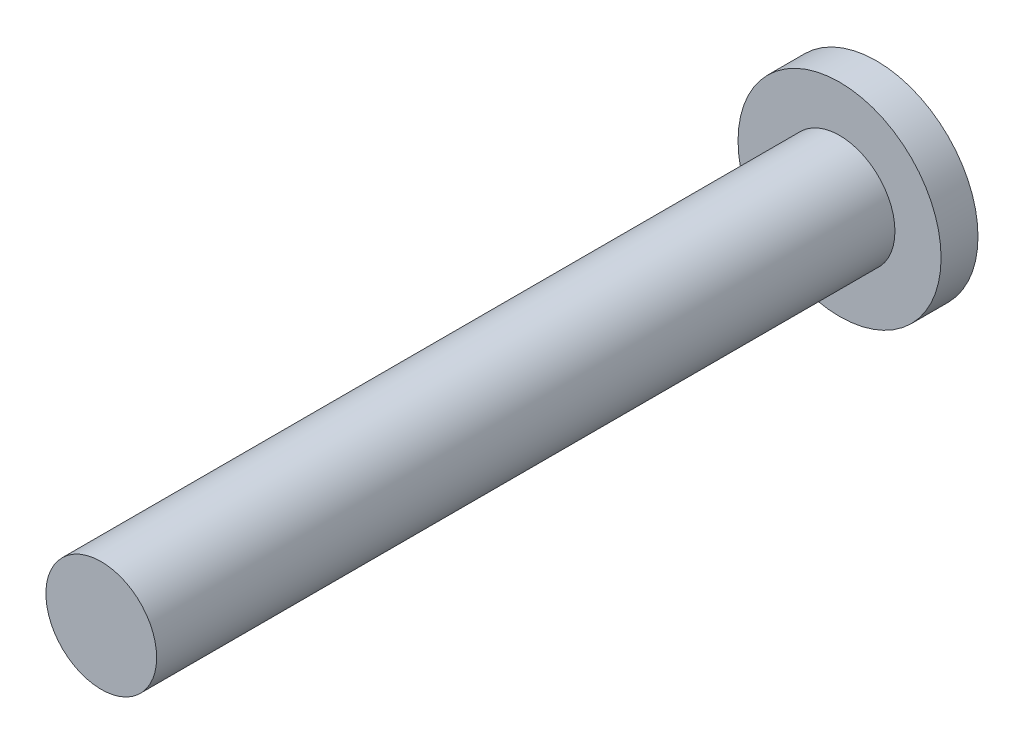
ISO-10303-21;
HEADER;
FILE_DESCRIPTION(('STEP AP214'),'2;1');
FILE_NAME('part.step','',(''),(''),'','','');
FILE_SCHEMA(('AUTOMOTIVE_DESIGN { 1 0 10303 214 1 1 1 1 }'));
ENDSEC;
DATA;
#1=APPLICATION_CONTEXT('core data for automotive mechanical design processes');
#2=APPLICATION_PROTOCOL_DEFINITION('international standard','automotive_design',2000,#1);
#3=PRODUCT_CONTEXT('',#1,'mechanical');
#4=PRODUCT('Part','Part','',(#3));
#5=PRODUCT_RELATED_PRODUCT_CATEGORY('part','',(#4));
#6=PRODUCT_DEFINITION_FORMATION('','',#4);
#7=PRODUCT_DEFINITION_CONTEXT('part definition',#1,'design');
#8=PRODUCT_DEFINITION('design','',#6,#7);
#9=PRODUCT_DEFINITION_SHAPE('','',#8);
#10=(LENGTH_UNIT() NAMED_UNIT(*) SI_UNIT(.MILLI.,.METRE.));
#11=(NAMED_UNIT(*) PLANE_ANGLE_UNIT() SI_UNIT($,.RADIAN.));
#12=(NAMED_UNIT(*) SI_UNIT($,.STERADIAN.) SOLID_ANGLE_UNIT());
#13=UNCERTAINTY_MEASURE_WITH_UNIT(LENGTH_MEASURE(1.E-05),#10,'distance_accuracy_value','');
#14=(GEOMETRIC_REPRESENTATION_CONTEXT(3) GLOBAL_UNCERTAINTY_ASSIGNED_CONTEXT((#13)) GLOBAL_UNIT_ASSIGNED_CONTEXT((#10,
#11,#12)) REPRESENTATION_CONTEXT('',''));
#15=CARTESIAN_POINT('',(0.,0.,0.));
#16=DIRECTION('',(0.,0.,1.));
#17=DIRECTION('',(1.,0.,0.));
#18=AXIS2_PLACEMENT_3D('',#15,#16,#17);
#19=CARTESIAN_POINT('',(0.,0.,1.));
#20=DIRECTION('',(0.,0.,-1.));
#21=DIRECTION('',(-1.,0.,0.));
#22=AXIS2_PLACEMENT_3D('',#19,#20,#21);
#23=CYLINDRICAL_SURFACE('',#22,2.75);
#24=CARTESIAN_POINT('',(0.,0.,1.));
#25=DIRECTION('',(0.,0.,1.));
#26=DIRECTION('',(1.,0.,0.));
#27=AXIS2_PLACEMENT_3D('',#24,#25,#26);
#28=CIRCLE('',#27,2.75);
#29=CARTESIAN_POINT('',(2.75,0.,1.));
#30=VERTEX_POINT('',#29);
#31=EDGE_CURVE('E25',#30,#30,#28,.T.);
#32=ORIENTED_EDGE('',*,*,#31,.F.);
#33=EDGE_LOOP('',(#32));
#34=FACE_BOUND('',#33,.T.);
#35=CARTESIAN_POINT('',(0.,0.,0.));
#36=DIRECTION('',(0.,0.,1.));
#37=DIRECTION('',(1.,0.,0.));
#38=AXIS2_PLACEMENT_3D('',#35,#36,#37);
#39=CIRCLE('',#38,2.75);
#40=CARTESIAN_POINT('',(2.75,0.,0.));
#41=VERTEX_POINT('',#40);
#42=EDGE_CURVE('E20',#41,#41,#39,.T.);
#43=ORIENTED_EDGE('',*,*,#42,.T.);
#44=EDGE_LOOP('',(#43));
#45=FACE_BOUND('',#44,.T.);
#46=ADVANCED_FACE('F17',(#34,#45),#23,.T.);
#47=CARTESIAN_POINT('',(0.,0.,1.));
#48=DIRECTION('',(0.,0.,1.));
#49=DIRECTION('',(1.,0.,0.));
#50=AXIS2_PLACEMENT_3D('',#47,#48,#49);
#51=PLANE('',#50);
#52=CARTESIAN_POINT('',(0.,0.,1.));
#53=DIRECTION('',(0.,0.,1.));
#54=DIRECTION('',(1.,0.,0.));
#55=AXIS2_PLACEMENT_3D('',#52,#53,#54);
#56=CIRCLE('',#55,1.5);
#57=CARTESIAN_POINT('',(1.5,0.,1.));
#58=VERTEX_POINT('',#57);
#59=EDGE_CURVE('E11',#58,#58,#56,.T.);
#60=ORIENTED_EDGE('',*,*,#59,.F.);
#61=EDGE_LOOP('',(#60));
#62=FACE_BOUND('',#61,.T.);
#63=ORIENTED_EDGE('',*,*,#31,.T.);
#64=EDGE_LOOP('',(#63));
#65=FACE_BOUND('',#64,.T.);
#66=ADVANCED_FACE('F203',(#62,#65),#51,.T.);
#67=CARTESIAN_POINT('',(0.,0.,0.));
#68=DIRECTION('',(0.,0.,1.));
#69=DIRECTION('',(1.,0.,0.));
#70=AXIS2_PLACEMENT_3D('',#67,#68,#69);
#71=PLANE('',#70);
#72=DIRECTION('',(1.,0.,0.));
#73=VECTOR('',#72,1.);
#74=CARTESIAN_POINT('',(0.25,0.25,0.));
#75=LINE('',#74,#73);
#76=CARTESIAN_POINT('',(0.25,0.25,0.));
#77=VERTEX_POINT('',#76);
#78=CARTESIAN_POINT('',(2.25,0.25,0.));
#79=VERTEX_POINT('',#78);
#80=EDGE_CURVE('E143',#77,#79,#75,.T.);
#81=ORIENTED_EDGE('',*,*,#80,.F.);
#82=DIRECTION('',(0.,-1.,0.));
#83=VECTOR('',#82,1.);
#84=CARTESIAN_POINT('',(0.25,0.25,0.));
#85=LINE('',#84,#83);
#86=CARTESIAN_POINT('',(0.25,2.25,0.));
#87=VERTEX_POINT('',#86);
#88=EDGE_CURVE('E33',#87,#77,#85,.T.);
#89=ORIENTED_EDGE('',*,*,#88,.F.);
#90=DIRECTION('',(1.,0.,0.));
#91=VECTOR('',#90,1.);
#92=CARTESIAN_POINT('',(-0.25,2.25,0.));
#93=LINE('',#92,#91);
#94=CARTESIAN_POINT('',(-0.25,2.25,0.));
#95=VERTEX_POINT('',#94);
#96=EDGE_CURVE('E170',#95,#87,#93,.T.);
#97=ORIENTED_EDGE('',*,*,#96,.F.);
#98=DIRECTION('',(0.,1.,0.));
#99=VECTOR('',#98,1.);
#100=CARTESIAN_POINT('',(-0.25,0.25,0.));
#101=LINE('',#100,#99);
#102=CARTESIAN_POINT('',(-0.25,0.25,0.));
#103=VERTEX_POINT('',#102);
#104=EDGE_CURVE('E168',#103,#95,#101,.T.);
#105=ORIENTED_EDGE('',*,*,#104,.F.);
#106=DIRECTION('',(1.,0.,0.));
#107=VECTOR('',#106,1.);
#108=CARTESIAN_POINT('',(-2.25,0.25,0.));
#109=LINE('',#108,#107);
#110=CARTESIAN_POINT('',(-2.25,0.25,0.));
#111=VERTEX_POINT('',#110);
#112=EDGE_CURVE('E117',#111,#103,#109,.T.);
#113=ORIENTED_EDGE('',*,*,#112,.F.);
#114=DIRECTION('',(0.,1.,0.));
#115=VECTOR('',#114,1.);
#116=CARTESIAN_POINT('',(-2.25,0.25,0.));
#117=LINE('',#116,#115);
#118=CARTESIAN_POINT('',(-2.25,-0.25,0.));
#119=VERTEX_POINT('',#118);
#120=EDGE_CURVE('E164',#119,#111,#117,.T.);
#121=ORIENTED_EDGE('',*,*,#120,.F.);
#122=DIRECTION('',(-1.,0.,0.));
#123=VECTOR('',#122,1.);
#124=CARTESIAN_POINT('',(-2.25,-0.25,0.));
#125=LINE('',#124,#123);
#126=CARTESIAN_POINT('',(-0.25,-0.25,0.));
#127=VERTEX_POINT('',#126);
#128=EDGE_CURVE('E161',#127,#119,#125,.T.);
#129=ORIENTED_EDGE('',*,*,#128,.F.);
#130=DIRECTION('',(0.,1.,0.));
#131=VECTOR('',#130,1.);
#132=CARTESIAN_POINT('',(-0.25,-2.25,0.));
#133=LINE('',#132,#131);
#134=CARTESIAN_POINT('',(-0.25,-2.25,0.));
#135=VERTEX_POINT('',#134);
#136=EDGE_CURVE('E158',#135,#127,#133,.T.);
#137=ORIENTED_EDGE('',*,*,#136,.F.);
#138=DIRECTION('',(-1.,0.,0.));
#139=VECTOR('',#138,1.);
#140=CARTESIAN_POINT('',(-0.25,-2.25,0.));
#141=LINE('',#140,#139);
#142=CARTESIAN_POINT('',(0.25,-2.25,0.));
#143=VERTEX_POINT('',#142);
#144=EDGE_CURVE('E155',#143,#135,#141,.T.);
#145=ORIENTED_EDGE('',*,*,#144,.F.);
#146=DIRECTION('',(0.,-1.,0.));
#147=VECTOR('',#146,1.);
#148=CARTESIAN_POINT('',(0.25,-2.25,0.));
#149=LINE('',#148,#147);
#150=CARTESIAN_POINT('',(0.25,-0.25,0.));
#151=VERTEX_POINT('',#150);
#152=EDGE_CURVE('E152',#151,#143,#149,.T.);
#153=ORIENTED_EDGE('',*,*,#152,.F.);
#154=DIRECTION('',(-1.,0.,0.));
#155=VECTOR('',#154,1.);
#156=CARTESIAN_POINT('',(0.25,-0.25,0.));
#157=LINE('',#156,#155);
#158=CARTESIAN_POINT('',(2.25,-0.25,0.));
#159=VERTEX_POINT('',#158);
#160=EDGE_CURVE('E149',#159,#151,#157,.T.);
#161=ORIENTED_EDGE('',*,*,#160,.F.);
#162=DIRECTION('',(0.,-1.,0.));
#163=VECTOR('',#162,1.);
#164=CARTESIAN_POINT('',(2.25,0.25,0.));
#165=LINE('',#164,#163);
#166=EDGE_CURVE('E146',#79,#159,#165,.T.);
#167=ORIENTED_EDGE('',*,*,#166,.F.);
#168=EDGE_LOOP('',(#81,#89,#97,#105,#113,#121,#129,#137,#145,#153,#161,#167));
#169=FACE_BOUND('',#168,.T.);
#170=ORIENTED_EDGE('',*,*,#42,.F.);
#171=EDGE_LOOP('',(#170));
#172=FACE_BOUND('',#171,.T.);
#173=ADVANCED_FACE('F200',(#169,#172),#71,.F.);
#174=CARTESIAN_POINT('',(0.,0.,21.));
#175=DIRECTION('',(0.,0.,-1.));
#176=DIRECTION('',(-1.,0.,0.));
#177=AXIS2_PLACEMENT_3D('',#174,#175,#176);
#178=CYLINDRICAL_SURFACE('',#177,1.5);
#179=CARTESIAN_POINT('',(0.,0.,21.));
#180=DIRECTION('',(0.,0.,1.));
#181=DIRECTION('',(1.,0.,0.));
#182=AXIS2_PLACEMENT_3D('',#179,#180,#181);
#183=CIRCLE('',#182,1.5);
#184=CARTESIAN_POINT('',(1.5,0.,21.));
#185=VERTEX_POINT('',#184);
#186=EDGE_CURVE('E174',#185,#185,#183,.T.);
#187=ORIENTED_EDGE('',*,*,#186,.F.);
#188=EDGE_LOOP('',(#187));
#189=FACE_BOUND('',#188,.T.);
#190=ORIENTED_EDGE('',*,*,#59,.T.);
#191=EDGE_LOOP('',(#190));
#192=FACE_BOUND('',#191,.T.);
#193=ADVANCED_FACE('F202',(#189,#192),#178,.T.);
#194=CARTESIAN_POINT('',(0.,0.,21.));
#195=DIRECTION('',(0.,0.,1.));
#196=DIRECTION('',(1.,0.,0.));
#197=AXIS2_PLACEMENT_3D('',#194,#195,#196);
#198=PLANE('',#197);
#199=ORIENTED_EDGE('',*,*,#186,.T.);
#200=EDGE_LOOP('',(#199));
#201=FACE_BOUND('',#200,.T.);
#202=ADVANCED_FACE('F211',(#201),#198,.T.);
#203=CARTESIAN_POINT('',(0.25,0.25,0.5));
#204=DIRECTION('',(1.,0.,0.));
#205=DIRECTION('',(0.,0.,-1.));
#206=AXIS2_PLACEMENT_3D('',#203,#204,#205);
#207=PLANE('',#206);
#208=ORIENTED_EDGE('',*,*,#88,.T.);
#209=DIRECTION('',(0.,0.,-1.));
#210=VECTOR('',#209,1.);
#211=CARTESIAN_POINT('',(0.25,0.25,0.5));
#212=LINE('',#211,#210);
#213=CARTESIAN_POINT('',(0.25,0.25,0.5));
#214=VERTEX_POINT('',#213);
#215=EDGE_CURVE('E81',#214,#77,#212,.T.);
#216=ORIENTED_EDGE('',*,*,#215,.F.);
#217=DIRECTION('',(0.,-1.,0.));
#218=VECTOR('',#217,1.);
#219=CARTESIAN_POINT('',(0.25,0.25,0.5));
#220=LINE('',#219,#218);
#221=CARTESIAN_POINT('',(0.25,2.25,0.5));
#222=VERTEX_POINT('',#221);
#223=EDGE_CURVE('E172',#222,#214,#220,.T.);
#224=ORIENTED_EDGE('',*,*,#223,.F.);
#225=DIRECTION('',(0.,0.,-1.));
#226=VECTOR('',#225,1.);
#227=CARTESIAN_POINT('',(0.25,2.25,0.5));
#228=LINE('',#227,#226);
#229=EDGE_CURVE('E41',#222,#87,#228,.T.);
#230=ORIENTED_EDGE('',*,*,#229,.T.);
#231=EDGE_LOOP('',(#208,#216,#224,#230));
#232=FACE_BOUND('',#231,.T.);
#233=ADVANCED_FACE('F249',(#232),#207,.F.);
#234=CARTESIAN_POINT('',(-0.25,2.25,0.5));
#235=DIRECTION('',(0.,1.,0.));
#236=DIRECTION('',(0.,0.,1.));
#237=AXIS2_PLACEMENT_3D('',#234,#235,#236);
#238=PLANE('',#237);
#239=ORIENTED_EDGE('',*,*,#96,.T.);
#240=ORIENTED_EDGE('',*,*,#229,.F.);
#241=DIRECTION('',(1.,0.,0.));
#242=VECTOR('',#241,1.);
#243=CARTESIAN_POINT('',(-0.25,2.25,0.5));
#244=LINE('',#243,#242);
#245=CARTESIAN_POINT('',(-0.25,2.25,0.5));
#246=VERTEX_POINT('',#245);
#247=EDGE_CURVE('E129',#246,#222,#244,.T.);
#248=ORIENTED_EDGE('',*,*,#247,.F.);
#249=DIRECTION('',(0.,0.,-1.));
#250=VECTOR('',#249,1.);
#251=CARTESIAN_POINT('',(-0.25,2.25,0.5));
#252=LINE('',#251,#250);
#253=EDGE_CURVE('E121',#246,#95,#252,.T.);
#254=ORIENTED_EDGE('',*,*,#253,.T.);
#255=EDGE_LOOP('',(#239,#240,#248,#254));
#256=FACE_BOUND('',#255,.T.);
#257=ADVANCED_FACE('F259',(#256),#238,.F.);
#258=CARTESIAN_POINT('',(-0.25,0.25,0.5));
#259=DIRECTION('',(-1.,0.,0.));
#260=DIRECTION('',(0.,-1.,0.));
#261=AXIS2_PLACEMENT_3D('',#258,#259,#260);
#262=PLANE('',#261);
#263=ORIENTED_EDGE('',*,*,#104,.T.);
#264=ORIENTED_EDGE('',*,*,#253,.F.);
#265=DIRECTION('',(0.,1.,0.));
#266=VECTOR('',#265,1.);
#267=CARTESIAN_POINT('',(-0.25,0.25,0.5));
#268=LINE('',#267,#266);
#269=CARTESIAN_POINT('',(-0.25,0.25,0.5));
#270=VERTEX_POINT('',#269);
#271=EDGE_CURVE('E125',#270,#246,#268,.T.);
#272=ORIENTED_EDGE('',*,*,#271,.F.);
#273=DIRECTION('',(0.,0.,-1.));
#274=VECTOR('',#273,1.);
#275=CARTESIAN_POINT('',(-0.25,0.25,0.5));
#276=LINE('',#275,#274);
#277=EDGE_CURVE('E110',#270,#103,#276,.T.);
#278=ORIENTED_EDGE('',*,*,#277,.T.);
#279=EDGE_LOOP('',(#263,#264,#272,#278));
#280=FACE_BOUND('',#279,.T.);
#281=ADVANCED_FACE('F126',(#280),#262,.F.);
#282=CARTESIAN_POINT('',(-2.25,0.25,0.5));
#283=DIRECTION('',(0.,1.,0.));
#284=DIRECTION('',(-1.,0.,0.));
#285=AXIS2_PLACEMENT_3D('',#282,#283,#284);
#286=PLANE('',#285);
#287=ORIENTED_EDGE('',*,*,#112,.T.);
#288=ORIENTED_EDGE('',*,*,#277,.F.);
#289=DIRECTION('',(1.,0.,0.));
#290=VECTOR('',#289,1.);
#291=CARTESIAN_POINT('',(-2.25,0.25,0.5));
#292=LINE('',#291,#290);
#293=CARTESIAN_POINT('',(-2.25,0.25,0.5));
#294=VERTEX_POINT('',#293);
#295=EDGE_CURVE('E114',#294,#270,#292,.T.);
#296=ORIENTED_EDGE('',*,*,#295,.F.);
#297=DIRECTION('',(0.,0.,-1.));
#298=VECTOR('',#297,1.);
#299=CARTESIAN_POINT('',(-2.25,0.25,0.5));
#300=LINE('',#299,#298);
#301=EDGE_CURVE('E122',#294,#111,#300,.T.);
#302=ORIENTED_EDGE('',*,*,#301,.T.);
#303=EDGE_LOOP('',(#287,#288,#296,#302));
#304=FACE_BOUND('',#303,.T.);
#305=ADVANCED_FACE('F112',(#304),#286,.F.);
#306=CARTESIAN_POINT('',(-2.25,0.25,0.5));
#307=DIRECTION('',(-1.,0.,0.));
#308=DIRECTION('',(0.,0.,1.));
#309=AXIS2_PLACEMENT_3D('',#306,#307,#308);
#310=PLANE('',#309);
#311=ORIENTED_EDGE('',*,*,#120,.T.);
#312=ORIENTED_EDGE('',*,*,#301,.F.);
#313=DIRECTION('',(0.,1.,0.));
#314=VECTOR('',#313,1.);
#315=CARTESIAN_POINT('',(-2.25,0.25,0.5));
#316=LINE('',#315,#314);
#317=CARTESIAN_POINT('',(-2.25,-0.25,0.5));
#318=VERTEX_POINT('',#317);
#319=EDGE_CURVE('E135',#318,#294,#316,.T.);
#320=ORIENTED_EDGE('',*,*,#319,.F.);
#321=DIRECTION('',(0.,0.,-1.));
#322=VECTOR('',#321,1.);
#323=CARTESIAN_POINT('',(-2.25,-0.25,0.5));
#324=LINE('',#323,#322);
#325=EDGE_CURVE('E177',#318,#119,#324,.T.);
#326=ORIENTED_EDGE('',*,*,#325,.T.);
#327=EDGE_LOOP('',(#311,#312,#320,#326));
#328=FACE_BOUND('',#327,.T.);
#329=ADVANCED_FACE('F284',(#328),#310,.F.);
#330=CARTESIAN_POINT('',(-2.25,-0.25,0.5));
#331=DIRECTION('',(0.,-1.,0.));
#332=DIRECTION('',(1.,0.,0.));
#333=AXIS2_PLACEMENT_3D('',#330,#331,#332);
#334=PLANE('',#333);
#335=ORIENTED_EDGE('',*,*,#128,.T.);
#336=ORIENTED_EDGE('',*,*,#325,.F.);
#337=DIRECTION('',(-1.,0.,0.));
#338=VECTOR('',#337,1.);
#339=CARTESIAN_POINT('',(-2.25,-0.25,0.5));
#340=LINE('',#339,#338);
#341=CARTESIAN_POINT('',(-0.25,-0.25,0.5));
#342=VERTEX_POINT('',#341);
#343=EDGE_CURVE('E137',#342,#318,#340,.T.);
#344=ORIENTED_EDGE('',*,*,#343,.F.);
#345=DIRECTION('',(0.,0.,-1.));
#346=VECTOR('',#345,1.);
#347=CARTESIAN_POINT('',(-0.25,-0.25,0.5));
#348=LINE('',#347,#346);
#349=EDGE_CURVE('E179',#342,#127,#348,.T.);
#350=ORIENTED_EDGE('',*,*,#349,.T.);
#351=EDGE_LOOP('',(#335,#336,#344,#350));
#352=FACE_BOUND('',#351,.T.);
#353=ADVANCED_FACE('F293',(#352),#334,.F.);
#354=CARTESIAN_POINT('',(-0.25,-2.25,0.5));
#355=DIRECTION('',(-1.,0.,0.));
#356=DIRECTION('',(0.,-1.,0.));
#357=AXIS2_PLACEMENT_3D('',#354,#355,#356);
#358=PLANE('',#357);
#359=ORIENTED_EDGE('',*,*,#136,.T.);
#360=ORIENTED_EDGE('',*,*,#349,.F.);
#361=DIRECTION('',(0.,1.,0.));
#362=VECTOR('',#361,1.);
#363=CARTESIAN_POINT('',(-0.25,-2.25,0.5));
#364=LINE('',#363,#362);
#365=CARTESIAN_POINT('',(-0.25,-2.25,0.5));
#366=VERTEX_POINT('',#365);
#367=EDGE_CURVE('E399',#366,#342,#364,.T.);
#368=ORIENTED_EDGE('',*,*,#367,.F.);
#369=DIRECTION('',(0.,0.,-1.));
#370=VECTOR('',#369,1.);
#371=CARTESIAN_POINT('',(-0.25,-2.25,0.5));
#372=LINE('',#371,#370);
#373=EDGE_CURVE('E181',#366,#135,#372,.T.);
#374=ORIENTED_EDGE('',*,*,#373,.T.);
#375=EDGE_LOOP('',(#359,#360,#368,#374));
#376=FACE_BOUND('',#375,.T.);
#377=ADVANCED_FACE('F303',(#376),#358,.F.);
#378=CARTESIAN_POINT('',(-0.25,-2.25,0.5));
#379=DIRECTION('',(0.,-1.,0.));
#380=DIRECTION('',(0.,0.,-1.));
#381=AXIS2_PLACEMENT_3D('',#378,#379,#380);
#382=PLANE('',#381);
#383=ORIENTED_EDGE('',*,*,#144,.T.);
#384=ORIENTED_EDGE('',*,*,#373,.F.);
#385=DIRECTION('',(-1.,0.,0.));
#386=VECTOR('',#385,1.);
#387=CARTESIAN_POINT('',(-0.25,-2.25,0.5));
#388=LINE('',#387,#386);
#389=CARTESIAN_POINT('',(0.25,-2.25,0.5));
#390=VERTEX_POINT('',#389);
#391=EDGE_CURVE('E396',#390,#366,#388,.T.);
#392=ORIENTED_EDGE('',*,*,#391,.F.);
#393=DIRECTION('',(0.,0.,-1.));
#394=VECTOR('',#393,1.);
#395=CARTESIAN_POINT('',(0.25,-2.25,0.5));
#396=LINE('',#395,#394);
#397=EDGE_CURVE('E183',#390,#143,#396,.T.);
#398=ORIENTED_EDGE('',*,*,#397,.T.);
#399=EDGE_LOOP('',(#383,#384,#392,#398));
#400=FACE_BOUND('',#399,.T.);
#401=ADVANCED_FACE('F313',(#400),#382,.F.);
#402=CARTESIAN_POINT('',(0.25,-2.25,0.5));
#403=DIRECTION('',(1.,0.,0.));
#404=DIRECTION('',(0.,1.,0.));
#405=AXIS2_PLACEMENT_3D('',#402,#403,#404);
#406=PLANE('',#405);
#407=ORIENTED_EDGE('',*,*,#152,.T.);
#408=ORIENTED_EDGE('',*,*,#397,.F.);
#409=DIRECTION('',(0.,-1.,0.));
#410=VECTOR('',#409,1.);
#411=CARTESIAN_POINT('',(0.25,-2.25,0.5));
#412=LINE('',#411,#410);
#413=CARTESIAN_POINT('',(0.25,-0.25,0.5));
#414=VERTEX_POINT('',#413);
#415=EDGE_CURVE('E393',#414,#390,#412,.T.);
#416=ORIENTED_EDGE('',*,*,#415,.F.);
#417=DIRECTION('',(0.,0.,-1.));
#418=VECTOR('',#417,1.);
#419=CARTESIAN_POINT('',(0.25,-0.25,0.5));
#420=LINE('',#419,#418);
#421=EDGE_CURVE('E185',#414,#151,#420,.T.);
#422=ORIENTED_EDGE('',*,*,#421,.T.);
#423=EDGE_LOOP('',(#407,#408,#416,#422));
#424=FACE_BOUND('',#423,.T.);
#425=ADVANCED_FACE('F323',(#424),#406,.F.);
#426=CARTESIAN_POINT('',(0.25,-0.25,0.5));
#427=DIRECTION('',(0.,-1.,0.));
#428=DIRECTION('',(1.,0.,0.));
#429=AXIS2_PLACEMENT_3D('',#426,#427,#428);
#430=PLANE('',#429);
#431=ORIENTED_EDGE('',*,*,#160,.T.);
#432=ORIENTED_EDGE('',*,*,#421,.F.);
#433=DIRECTION('',(-1.,0.,0.));
#434=VECTOR('',#433,1.);
#435=CARTESIAN_POINT('',(0.25,-0.25,0.5));
#436=LINE('',#435,#434);
#437=CARTESIAN_POINT('',(2.25,-0.25,0.5));
#438=VERTEX_POINT('',#437);
#439=EDGE_CURVE('E386',#438,#414,#436,.T.);
#440=ORIENTED_EDGE('',*,*,#439,.F.);
#441=DIRECTION('',(0.,0.,-1.));
#442=VECTOR('',#441,1.);
#443=CARTESIAN_POINT('',(2.25,-0.25,0.5));
#444=LINE('',#443,#442);
#445=EDGE_CURVE('E187',#438,#159,#444,.T.);
#446=ORIENTED_EDGE('',*,*,#445,.T.);
#447=EDGE_LOOP('',(#431,#432,#440,#446));
#448=FACE_BOUND('',#447,.T.);
#449=ADVANCED_FACE('F333',(#448),#430,.F.);
#450=CARTESIAN_POINT('',(2.25,0.25,0.5));
#451=DIRECTION('',(1.,0.,0.));
#452=DIRECTION('',(0.,0.,-1.));
#453=AXIS2_PLACEMENT_3D('',#450,#451,#452);
#454=PLANE('',#453);
#455=ORIENTED_EDGE('',*,*,#166,.T.);
#456=ORIENTED_EDGE('',*,*,#445,.F.);
#457=DIRECTION('',(0.,-1.,0.));
#458=VECTOR('',#457,1.);
#459=CARTESIAN_POINT('',(2.25,0.25,0.5));
#460=LINE('',#459,#458);
#461=CARTESIAN_POINT('',(2.25,0.25,0.5));
#462=VERTEX_POINT('',#461);
#463=EDGE_CURVE('E383',#462,#438,#460,.T.);
#464=ORIENTED_EDGE('',*,*,#463,.F.);
#465=DIRECTION('',(0.,0.,-1.));
#466=VECTOR('',#465,1.);
#467=CARTESIAN_POINT('',(2.25,0.25,0.5));
#468=LINE('',#467,#466);
#469=EDGE_CURVE('E189',#462,#79,#468,.T.);
#470=ORIENTED_EDGE('',*,*,#469,.T.);
#471=EDGE_LOOP('',(#455,#456,#464,#470));
#472=FACE_BOUND('',#471,.T.);
#473=ADVANCED_FACE('F343',(#472),#454,.F.);
#474=CARTESIAN_POINT('',(0.25,0.25,0.5));
#475=DIRECTION('',(0.,1.,0.));
#476=DIRECTION('',(-1.,0.,0.));
#477=AXIS2_PLACEMENT_3D('',#474,#475,#476);
#478=PLANE('',#477);
#479=ORIENTED_EDGE('',*,*,#80,.T.);
#480=ORIENTED_EDGE('',*,*,#469,.F.);
#481=DIRECTION('',(1.,0.,0.));
#482=VECTOR('',#481,1.);
#483=CARTESIAN_POINT('',(0.25,0.25,0.5));
#484=LINE('',#483,#482);
#485=EDGE_CURVE('E387',#214,#462,#484,.T.);
#486=ORIENTED_EDGE('',*,*,#485,.F.);
#487=ORIENTED_EDGE('',*,*,#215,.T.);
#488=EDGE_LOOP('',(#479,#480,#486,#487));
#489=FACE_BOUND('',#488,.T.);
#490=ADVANCED_FACE('F353',(#489),#478,.F.);
#491=CARTESIAN_POINT('',(0.,0.,0.5));
#492=DIRECTION('',(0.,0.,-1.));
#493=DIRECTION('',(-1.,0.,0.));
#494=AXIS2_PLACEMENT_3D('',#491,#492,#493);
#495=PLANE('',#494);
#496=ORIENTED_EDGE('',*,*,#223,.T.);
#497=ORIENTED_EDGE('',*,*,#485,.T.);
#498=ORIENTED_EDGE('',*,*,#463,.T.);
#499=ORIENTED_EDGE('',*,*,#439,.T.);
#500=ORIENTED_EDGE('',*,*,#415,.T.);
#501=ORIENTED_EDGE('',*,*,#391,.T.);
#502=ORIENTED_EDGE('',*,*,#367,.T.);
#503=ORIENTED_EDGE('',*,*,#343,.T.);
#504=ORIENTED_EDGE('',*,*,#319,.T.);
#505=ORIENTED_EDGE('',*,*,#295,.T.);
#506=ORIENTED_EDGE('',*,*,#271,.T.);
#507=ORIENTED_EDGE('',*,*,#247,.T.);
#508=EDGE_LOOP('',(#496,#497,#498,#499,#500,#501,#502,#503,#504,#505,#506,#507));
#509=FACE_BOUND('',#508,.T.);
#510=ADVANCED_FACE('F132',(#509),#495,.T.);
#511=CLOSED_SHELL('',(#46,#66,#173,#193,#202,#233,#257,#281,#305,#329,#353,#377,#401,#425,#449,
#473,#490,#510));
#512=MANIFOLD_SOLID_BREP('B1',#511);
#513=ADVANCED_BREP_SHAPE_REPRESENTATION('',(#18,#512),#14);
#514=SHAPE_DEFINITION_REPRESENTATION(#9,#513);
ENDSEC;
END-ISO-10303-21;
